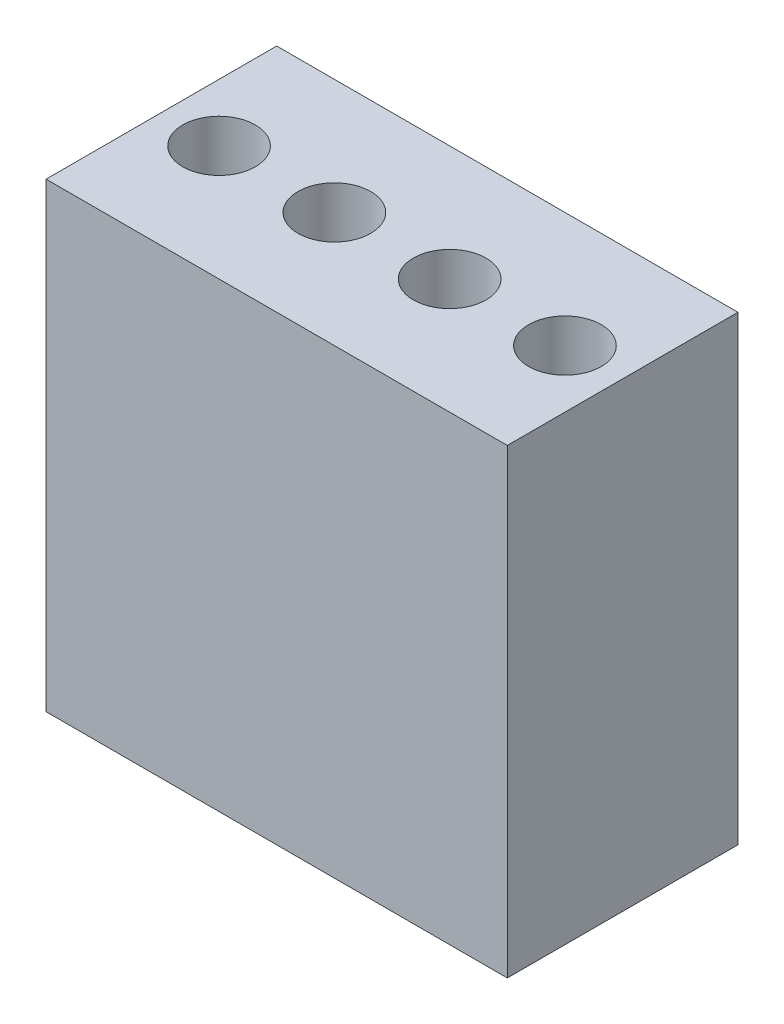
ISO-10303-21;
HEADER;
FILE_DESCRIPTION(('STEP AP214'),'2;1');
FILE_NAME('part.step','',(''),(''),'','','');
FILE_SCHEMA(('AUTOMOTIVE_DESIGN { 1 0 10303 214 1 1 1 1 }'));
ENDSEC;
DATA;
#1=APPLICATION_CONTEXT('core data for automotive mechanical design processes');
#2=APPLICATION_PROTOCOL_DEFINITION('international standard','automotive_design',2000,#1);
#3=PRODUCT_CONTEXT('',#1,'mechanical');
#4=PRODUCT('Part','Part','',(#3));
#5=PRODUCT_RELATED_PRODUCT_CATEGORY('part','',(#4));
#6=PRODUCT_DEFINITION_FORMATION('','',#4);
#7=PRODUCT_DEFINITION_CONTEXT('part definition',#1,'design');
#8=PRODUCT_DEFINITION('design','',#6,#7);
#9=PRODUCT_DEFINITION_SHAPE('','',#8);
#10=(LENGTH_UNIT() NAMED_UNIT(*) SI_UNIT(.MILLI.,.METRE.));
#11=(NAMED_UNIT(*) PLANE_ANGLE_UNIT() SI_UNIT($,.RADIAN.));
#12=(NAMED_UNIT(*) SI_UNIT($,.STERADIAN.) SOLID_ANGLE_UNIT());
#13=UNCERTAINTY_MEASURE_WITH_UNIT(LENGTH_MEASURE(1.E-05),#10,'distance_accuracy_value','');
#14=(GEOMETRIC_REPRESENTATION_CONTEXT(3) GLOBAL_UNCERTAINTY_ASSIGNED_CONTEXT((#13)) GLOBAL_UNIT_ASSIGNED_CONTEXT((#10,
#11,#12)) REPRESENTATION_CONTEXT('',''));
#15=CARTESIAN_POINT('',(0.,0.,0.));
#16=DIRECTION('',(0.,0.,1.));
#17=DIRECTION('',(1.,0.,0.));
#18=AXIS2_PLACEMENT_3D('',#15,#16,#17);
#19=CARTESIAN_POINT('',(0.,12.7,0.));
#20=DIRECTION('',(0.,-1.,0.));
#21=DIRECTION('',(0.,0.,-1.));
#22=AXIS2_PLACEMENT_3D('',#19,#20,#21);
#23=PLANE('',#22);
#24=DIRECTION('',(0.,0.,1.));
#25=VECTOR('',#24,1.);
#26=CARTESIAN_POINT('',(0.,12.7,0.));
#27=LINE('',#26,#25);
#28=CARTESIAN_POINT('',(0.,12.7,-6.35));
#29=VERTEX_POINT('',#28);
#30=CARTESIAN_POINT('',(0.,12.7,0.));
#31=VERTEX_POINT('',#30);
#32=EDGE_CURVE('E100',#29,#31,#27,.T.);
#33=ORIENTED_EDGE('',*,*,#32,.T.);
#34=DIRECTION('',(1.,0.,0.));
#35=VECTOR('',#34,1.);
#36=CARTESIAN_POINT('',(0.,12.7,0.));
#37=LINE('',#36,#35);
#38=CARTESIAN_POINT('',(12.7,12.7,0.));
#39=VERTEX_POINT('',#38);
#40=EDGE_CURVE('E95',#31,#39,#37,.T.);
#41=ORIENTED_EDGE('',*,*,#40,.T.);
#42=DIRECTION('',(0.,0.,-1.));
#43=VECTOR('',#42,1.);
#44=CARTESIAN_POINT('',(12.7,12.7,0.));
#45=LINE('',#44,#43);
#46=CARTESIAN_POINT('',(12.7,12.7,-6.35));
#47=VERTEX_POINT('',#46);
#48=EDGE_CURVE('E98',#39,#47,#45,.T.);
#49=ORIENTED_EDGE('',*,*,#48,.T.);
#50=DIRECTION('',(-1.,0.,0.));
#51=VECTOR('',#50,1.);
#52=CARTESIAN_POINT('',(0.,12.7,-6.35));
#53=LINE('',#52,#51);
#54=EDGE_CURVE('E65',#47,#29,#53,.T.);
#55=ORIENTED_EDGE('',*,*,#54,.T.);
#56=EDGE_LOOP('',(#33,#41,#49,#55));
#57=FACE_BOUND('',#56,.T.);
#58=CARTESIAN_POINT('',(1.5875,12.7,-3.175));
#59=DIRECTION('',(0.,1.,0.));
#60=DIRECTION('',(0.,0.,1.));
#61=AXIS2_PLACEMENT_3D('',#58,#59,#60);
#62=CIRCLE('',#61,1.);
#63=CARTESIAN_POINT('',(1.5875,12.7,-2.175));
#64=VERTEX_POINT('',#63);
#65=EDGE_CURVE('E120',#64,#64,#62,.T.);
#66=ORIENTED_EDGE('',*,*,#65,.F.);
#67=EDGE_LOOP('',(#66));
#68=FACE_BOUND('',#67,.T.);
#69=CARTESIAN_POINT('',(4.7625,12.7,-3.175));
#70=DIRECTION('',(0.,1.,0.));
#71=DIRECTION('',(0.,0.,1.));
#72=AXIS2_PLACEMENT_3D('',#69,#70,#71);
#73=CIRCLE('',#72,1.);
#74=CARTESIAN_POINT('',(4.7625,12.7,-2.175));
#75=VERTEX_POINT('',#74);
#76=EDGE_CURVE('E142',#75,#75,#73,.T.);
#77=ORIENTED_EDGE('',*,*,#76,.F.);
#78=EDGE_LOOP('',(#77));
#79=FACE_BOUND('',#78,.T.);
#80=CARTESIAN_POINT('',(7.9375,12.7,-3.175));
#81=DIRECTION('',(0.,1.,0.));
#82=DIRECTION('',(0.,0.,1.));
#83=AXIS2_PLACEMENT_3D('',#80,#81,#82);
#84=CIRCLE('',#83,1.);
#85=CARTESIAN_POINT('',(7.9375,12.7,-2.175));
#86=VERTEX_POINT('',#85);
#87=EDGE_CURVE('E150',#86,#86,#84,.T.);
#88=ORIENTED_EDGE('',*,*,#87,.F.);
#89=EDGE_LOOP('',(#88));
#90=FACE_BOUND('',#89,.T.);
#91=CARTESIAN_POINT('',(11.1125,12.7,-3.175));
#92=DIRECTION('',(0.,1.,0.));
#93=DIRECTION('',(0.,0.,1.));
#94=AXIS2_PLACEMENT_3D('',#91,#92,#93);
#95=CIRCLE('',#94,1.);
#96=CARTESIAN_POINT('',(11.1125,12.7,-2.175));
#97=VERTEX_POINT('',#96);
#98=EDGE_CURVE('E158',#97,#97,#95,.T.);
#99=ORIENTED_EDGE('',*,*,#98,.F.);
#100=EDGE_LOOP('',(#99));
#101=FACE_BOUND('',#100,.T.);
#102=ADVANCED_FACE('F47',(#57,#68,#79,#90,#101),#23,.F.);
#103=CARTESIAN_POINT('',(0.,0.,0.));
#104=DIRECTION('',(0.,-1.,0.));
#105=DIRECTION('',(0.,0.,-1.));
#106=AXIS2_PLACEMENT_3D('',#103,#104,#105);
#107=PLANE('',#106);
#108=CARTESIAN_POINT('',(7.9375,0.,-3.175));
#109=DIRECTION('',(0.,1.,0.));
#110=DIRECTION('',(0.,0.,1.));
#111=AXIS2_PLACEMENT_3D('',#108,#109,#110);
#112=CIRCLE('',#111,1.);
#113=CARTESIAN_POINT('',(7.9375,0.,-2.175));
#114=VERTEX_POINT('',#113);
#115=EDGE_CURVE('E154',#114,#114,#112,.T.);
#116=ORIENTED_EDGE('',*,*,#115,.T.);
#117=EDGE_LOOP('',(#116));
#118=FACE_BOUND('',#117,.T.);
#119=CARTESIAN_POINT('',(1.5875,0.,-3.175));
#120=DIRECTION('',(0.,1.,0.));
#121=DIRECTION('',(0.,0.,1.));
#122=AXIS2_PLACEMENT_3D('',#119,#120,#121);
#123=CIRCLE('',#122,1.);
#124=CARTESIAN_POINT('',(1.5875,0.,-2.175));
#125=VERTEX_POINT('',#124);
#126=EDGE_CURVE('E138',#125,#125,#123,.T.);
#127=ORIENTED_EDGE('',*,*,#126,.T.);
#128=EDGE_LOOP('',(#127));
#129=FACE_BOUND('',#128,.T.);
#130=DIRECTION('',(0.,0.,1.));
#131=VECTOR('',#130,1.);
#132=CARTESIAN_POINT('',(0.,0.,0.));
#133=LINE('',#132,#131);
#134=CARTESIAN_POINT('',(0.,0.,-6.35));
#135=VERTEX_POINT('',#134);
#136=CARTESIAN_POINT('',(0.,0.,0.));
#137=VERTEX_POINT('',#136);
#138=EDGE_CURVE('E116',#135,#137,#133,.T.);
#139=ORIENTED_EDGE('',*,*,#138,.F.);
#140=DIRECTION('',(-1.,0.,0.));
#141=VECTOR('',#140,1.);
#142=CARTESIAN_POINT('',(0.,0.,-6.35));
#143=LINE('',#142,#141);
#144=CARTESIAN_POINT('',(12.7,0.,-6.35));
#145=VERTEX_POINT('',#144);
#146=EDGE_CURVE('E88',#145,#135,#143,.T.);
#147=ORIENTED_EDGE('',*,*,#146,.F.);
#148=DIRECTION('',(0.,0.,-1.));
#149=VECTOR('',#148,1.);
#150=CARTESIAN_POINT('',(12.7,0.,0.));
#151=LINE('',#150,#149);
#152=CARTESIAN_POINT('',(12.7,0.,0.));
#153=VERTEX_POINT('',#152);
#154=EDGE_CURVE('E82',#153,#145,#151,.T.);
#155=ORIENTED_EDGE('',*,*,#154,.F.);
#156=DIRECTION('',(1.,0.,0.));
#157=VECTOR('',#156,1.);
#158=CARTESIAN_POINT('',(0.,0.,0.));
#159=LINE('',#158,#157);
#160=EDGE_CURVE('E105',#137,#153,#159,.T.);
#161=ORIENTED_EDGE('',*,*,#160,.F.);
#162=EDGE_LOOP('',(#139,#147,#155,#161));
#163=FACE_BOUND('',#162,.T.);
#164=CARTESIAN_POINT('',(4.7625,0.,-3.175));
#165=DIRECTION('',(0.,1.,0.));
#166=DIRECTION('',(0.,0.,1.));
#167=AXIS2_PLACEMENT_3D('',#164,#165,#166);
#168=CIRCLE('',#167,1.);
#169=CARTESIAN_POINT('',(4.7625,0.,-2.175));
#170=VERTEX_POINT('',#169);
#171=EDGE_CURVE('E146',#170,#170,#168,.T.);
#172=ORIENTED_EDGE('',*,*,#171,.T.);
#173=EDGE_LOOP('',(#172));
#174=FACE_BOUND('',#173,.T.);
#175=CARTESIAN_POINT('',(11.1125,0.,-3.175));
#176=DIRECTION('',(0.,1.,0.));
#177=DIRECTION('',(0.,0.,1.));
#178=AXIS2_PLACEMENT_3D('',#175,#176,#177);
#179=CIRCLE('',#178,1.);
#180=CARTESIAN_POINT('',(11.1125,0.,-2.175));
#181=VERTEX_POINT('',#180);
#182=EDGE_CURVE('E162',#181,#181,#179,.T.);
#183=ORIENTED_EDGE('',*,*,#182,.T.);
#184=EDGE_LOOP('',(#183));
#185=FACE_BOUND('',#184,.T.);
#186=ADVANCED_FACE('F133',(#118,#129,#163,#174,#185),#107,.T.);
#187=CARTESIAN_POINT('',(0.,12.7,0.));
#188=DIRECTION('',(1.,0.,0.));
#189=DIRECTION('',(0.,0.,-1.));
#190=AXIS2_PLACEMENT_3D('',#187,#188,#189);
#191=PLANE('',#190);
#192=ORIENTED_EDGE('',*,*,#138,.T.);
#193=DIRECTION('',(0.,-1.,0.));
#194=VECTOR('',#193,1.);
#195=CARTESIAN_POINT('',(0.,12.7,0.));
#196=LINE('',#195,#194);
#197=EDGE_CURVE('E11',#31,#137,#196,.T.);
#198=ORIENTED_EDGE('',*,*,#197,.F.);
#199=ORIENTED_EDGE('',*,*,#32,.F.);
#200=DIRECTION('',(0.,-1.,0.));
#201=VECTOR('',#200,1.);
#202=CARTESIAN_POINT('',(0.,12.7,-6.35));
#203=LINE('',#202,#201);
#204=EDGE_CURVE('E112',#29,#135,#203,.T.);
#205=ORIENTED_EDGE('',*,*,#204,.T.);
#206=EDGE_LOOP('',(#192,#198,#199,#205));
#207=FACE_BOUND('',#206,.T.);
#208=ADVANCED_FACE('F49',(#207),#191,.F.);
#209=CARTESIAN_POINT('',(0.,12.7,0.));
#210=DIRECTION('',(0.,0.,-1.));
#211=DIRECTION('',(-1.,0.,0.));
#212=AXIS2_PLACEMENT_3D('',#209,#210,#211);
#213=PLANE('',#212);
#214=ORIENTED_EDGE('',*,*,#160,.T.);
#215=DIRECTION('',(0.,-1.,0.));
#216=VECTOR('',#215,1.);
#217=CARTESIAN_POINT('',(12.7,12.7,0.));
#218=LINE('',#217,#216);
#219=EDGE_CURVE('E57',#39,#153,#218,.T.);
#220=ORIENTED_EDGE('',*,*,#219,.F.);
#221=ORIENTED_EDGE('',*,*,#40,.F.);
#222=ORIENTED_EDGE('',*,*,#197,.T.);
#223=EDGE_LOOP('',(#214,#220,#221,#222));
#224=FACE_BOUND('',#223,.T.);
#225=ADVANCED_FACE('F104',(#224),#213,.F.);
#226=CARTESIAN_POINT('',(12.7,12.7,0.));
#227=DIRECTION('',(-1.,0.,0.));
#228=DIRECTION('',(0.,0.,1.));
#229=AXIS2_PLACEMENT_3D('',#226,#227,#228);
#230=PLANE('',#229);
#231=ORIENTED_EDGE('',*,*,#154,.T.);
#232=DIRECTION('',(0.,-1.,0.));
#233=VECTOR('',#232,1.);
#234=CARTESIAN_POINT('',(12.7,12.7,-6.35));
#235=LINE('',#234,#233);
#236=EDGE_CURVE('E107',#47,#145,#235,.T.);
#237=ORIENTED_EDGE('',*,*,#236,.F.);
#238=ORIENTED_EDGE('',*,*,#48,.F.);
#239=ORIENTED_EDGE('',*,*,#219,.T.);
#240=EDGE_LOOP('',(#231,#237,#238,#239));
#241=FACE_BOUND('',#240,.T.);
#242=ADVANCED_FACE('F108',(#241),#230,.F.);
#243=CARTESIAN_POINT('',(0.,12.7,-6.35));
#244=DIRECTION('',(0.,0.,1.));
#245=DIRECTION('',(1.,0.,0.));
#246=AXIS2_PLACEMENT_3D('',#243,#244,#245);
#247=PLANE('',#246);
#248=ORIENTED_EDGE('',*,*,#146,.T.);
#249=ORIENTED_EDGE('',*,*,#204,.F.);
#250=ORIENTED_EDGE('',*,*,#54,.F.);
#251=ORIENTED_EDGE('',*,*,#236,.T.);
#252=EDGE_LOOP('',(#248,#249,#250,#251));
#253=FACE_BOUND('',#252,.T.);
#254=ADVANCED_FACE('F130',(#253),#247,.F.);
#255=CARTESIAN_POINT('',(1.5875,12.7,-3.175));
#256=DIRECTION('',(0.,-1.,0.));
#257=DIRECTION('',(0.,0.,-1.));
#258=AXIS2_PLACEMENT_3D('',#255,#256,#257);
#259=CYLINDRICAL_SURFACE('',#258,1.);
#260=ORIENTED_EDGE('',*,*,#65,.T.);
#261=EDGE_LOOP('',(#260));
#262=FACE_BOUND('',#261,.T.);
#263=ORIENTED_EDGE('',*,*,#126,.F.);
#264=EDGE_LOOP('',(#263));
#265=FACE_BOUND('',#264,.T.);
#266=ADVANCED_FACE('F181',(#262,#265),#259,.F.);
#267=CARTESIAN_POINT('',(4.7625,12.7,-3.175));
#268=DIRECTION('',(0.,-1.,0.));
#269=DIRECTION('',(0.,0.,-1.));
#270=AXIS2_PLACEMENT_3D('',#267,#268,#269);
#271=CYLINDRICAL_SURFACE('',#270,1.);
#272=ORIENTED_EDGE('',*,*,#76,.T.);
#273=EDGE_LOOP('',(#272));
#274=FACE_BOUND('',#273,.T.);
#275=ORIENTED_EDGE('',*,*,#171,.F.);
#276=EDGE_LOOP('',(#275));
#277=FACE_BOUND('',#276,.T.);
#278=ADVANCED_FACE('F226',(#274,#277),#271,.F.);
#279=CARTESIAN_POINT('',(7.9375,12.7,-3.175));
#280=DIRECTION('',(0.,-1.,0.));
#281=DIRECTION('',(0.,0.,-1.));
#282=AXIS2_PLACEMENT_3D('',#279,#280,#281);
#283=CYLINDRICAL_SURFACE('',#282,1.);
#284=ORIENTED_EDGE('',*,*,#87,.T.);
#285=EDGE_LOOP('',(#284));
#286=FACE_BOUND('',#285,.T.);
#287=ORIENTED_EDGE('',*,*,#115,.F.);
#288=EDGE_LOOP('',(#287));
#289=FACE_BOUND('',#288,.T.);
#290=ADVANCED_FACE('F234',(#286,#289),#283,.F.);
#291=CARTESIAN_POINT('',(11.1125,12.7,-3.175));
#292=DIRECTION('',(0.,-1.,0.));
#293=DIRECTION('',(0.,0.,-1.));
#294=AXIS2_PLACEMENT_3D('',#291,#292,#293);
#295=CYLINDRICAL_SURFACE('',#294,1.);
#296=ORIENTED_EDGE('',*,*,#98,.T.);
#297=EDGE_LOOP('',(#296));
#298=FACE_BOUND('',#297,.T.);
#299=ORIENTED_EDGE('',*,*,#182,.F.);
#300=EDGE_LOOP('',(#299));
#301=FACE_BOUND('',#300,.T.);
#302=ADVANCED_FACE('F170',(#298,#301),#295,.F.);
#303=CLOSED_SHELL('',(#102,#186,#208,#225,#242,#254,#266,#278,#290,#302));
#304=MANIFOLD_SOLID_BREP('B2',#303);
#305=ADVANCED_BREP_SHAPE_REPRESENTATION('',(#18,#304),#14);
#306=SHAPE_DEFINITION_REPRESENTATION(#9,#305);
ENDSEC;
END-ISO-10303-21;
